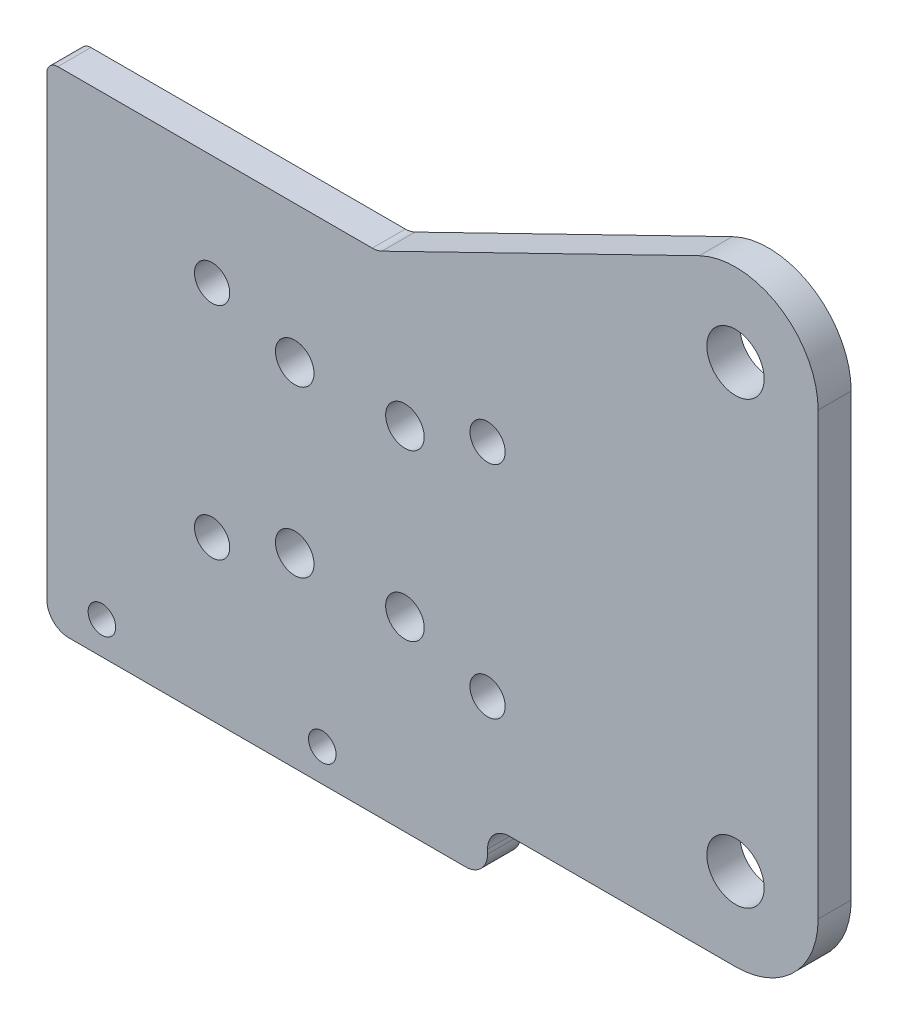
ISO-10303-21;
HEADER;
FILE_DESCRIPTION(('STEP AP214'),'2;1');
FILE_NAME('part.step','',(''),(''),'','','');
FILE_SCHEMA(('AUTOMOTIVE_DESIGN { 1 0 10303 214 1 1 1 1 }'));
ENDSEC;
DATA;
#1=APPLICATION_CONTEXT('core data for automotive mechanical design processes');
#2=APPLICATION_PROTOCOL_DEFINITION('international standard','automotive_design',2000,#1);
#3=PRODUCT_CONTEXT('',#1,'mechanical');
#4=PRODUCT('Part','Part','',(#3));
#5=PRODUCT_RELATED_PRODUCT_CATEGORY('part','',(#4));
#6=PRODUCT_DEFINITION_FORMATION('','',#4);
#7=PRODUCT_DEFINITION_CONTEXT('part definition',#1,'design');
#8=PRODUCT_DEFINITION('design','',#6,#7);
#9=PRODUCT_DEFINITION_SHAPE('','',#8);
#10=(LENGTH_UNIT() NAMED_UNIT(*) SI_UNIT(.MILLI.,.METRE.));
#11=(NAMED_UNIT(*) PLANE_ANGLE_UNIT() SI_UNIT($,.RADIAN.));
#12=(NAMED_UNIT(*) SI_UNIT($,.STERADIAN.) SOLID_ANGLE_UNIT());
#13=UNCERTAINTY_MEASURE_WITH_UNIT(LENGTH_MEASURE(1.E-05),#10,'distance_accuracy_value','');
#14=(GEOMETRIC_REPRESENTATION_CONTEXT(3) GLOBAL_UNCERTAINTY_ASSIGNED_CONTEXT((#13)) GLOBAL_UNIT_ASSIGNED_CONTEXT((#10,
#11,#12)) REPRESENTATION_CONTEXT('',''));
#15=CARTESIAN_POINT('',(0.,0.,0.));
#16=DIRECTION('',(0.,0.,1.));
#17=DIRECTION('',(1.,0.,0.));
#18=AXIS2_PLACEMENT_3D('',#15,#16,#17);
#19=CARTESIAN_POINT('',(27.5,20.,3.));
#20=DIRECTION('',(0.,0.,-1.));
#21=DIRECTION('',(-1.,0.,0.));
#22=AXIS2_PLACEMENT_3D('',#19,#20,#21);
#23=PLANE('',#22);
#24=CARTESIAN_POINT('',(-30.,-28.95,3.));
#25=DIRECTION('',(0.,0.,-1.));
#26=DIRECTION('',(-1.,0.,0.));
#27=AXIS2_PLACEMENT_3D('',#24,#25,#26);
#28=CIRCLE('',#27,1.25);
#29=CARTESIAN_POINT('',(-31.25,-28.95,3.));
#30=VERTEX_POINT('',#29);
#31=EDGE_CURVE('E280',#30,#30,#28,.T.);
#32=ORIENTED_EDGE('',*,*,#31,.T.);
#33=EDGE_LOOP('',(#32));
#34=FACE_BOUND('',#33,.T.);
#35=CARTESIAN_POINT('',(-10.,-28.9500000000002,3.));
#36=DIRECTION('',(0.,0.,-1.));
#37=DIRECTION('',(-1.,0.,0.));
#38=AXIS2_PLACEMENT_3D('',#35,#36,#37);
#39=CIRCLE('',#38,1.25);
#40=CARTESIAN_POINT('',(-11.25,-28.9500000000002,3.));
#41=VERTEX_POINT('',#40);
#42=EDGE_CURVE('E389',#41,#41,#39,.T.);
#43=ORIENTED_EDGE('',*,*,#42,.T.);
#44=EDGE_LOOP('',(#43));
#45=FACE_BOUND('',#44,.T.);
#46=DIRECTION('',(0.,-1.,0.));
#47=VECTOR('',#46,1.);
#48=CARTESIAN_POINT('',(-35.,-27.5,3.));
#49=LINE('',#48,#47);
#50=CARTESIAN_POINT('',(-35.,11.5,3.));
#51=VERTEX_POINT('',#50);
#52=CARTESIAN_POINT('',(-35.,-29.9,3.));
#53=VERTEX_POINT('',#52);
#54=EDGE_CURVE('E168',#51,#53,#49,.T.);
#55=ORIENTED_EDGE('',*,*,#54,.T.);
#56=CARTESIAN_POINT('',(-33.,-29.9,3.));
#57=DIRECTION('',(0.,0.,-1.));
#58=DIRECTION('',(-1.,0.,0.));
#59=AXIS2_PLACEMENT_3D('',#56,#57,#58);
#60=CIRCLE('',#59,2.);
#61=CARTESIAN_POINT('',(-33.,-31.9,3.));
#62=VERTEX_POINT('',#61);
#63=EDGE_CURVE('E251',#53,#62,#60,.F.);
#64=ORIENTED_EDGE('',*,*,#63,.T.);
#65=DIRECTION('',(1.,0.,0.));
#66=VECTOR('',#65,1.);
#67=CARTESIAN_POINT('',(-35.,-31.9,3.));
#68=LINE('',#67,#66);
#69=CARTESIAN_POINT('',(2.99999999999999,-31.9,3.));
#70=VERTEX_POINT('',#69);
#71=EDGE_CURVE('E396',#62,#70,#68,.T.);
#72=ORIENTED_EDGE('',*,*,#71,.T.);
#73=CARTESIAN_POINT('',(2.99999999999999,-29.9,3.));
#74=DIRECTION('',(0.,0.,-1.));
#75=DIRECTION('',(-1.,0.,0.));
#76=AXIS2_PLACEMENT_3D('',#73,#74,#75);
#77=CIRCLE('',#76,2.);
#78=CARTESIAN_POINT('',(4.99999999999999,-29.9,3.));
#79=VERTEX_POINT('',#78);
#80=EDGE_CURVE('E249',#70,#79,#77,.F.);
#81=ORIENTED_EDGE('',*,*,#80,.T.);
#82=DIRECTION('',(0.,1.,0.));
#83=VECTOR('',#82,1.);
#84=CARTESIAN_POINT('',(4.99999999999999,-26.5,3.));
#85=LINE('',#84,#83);
#86=CARTESIAN_POINT('',(4.99999999999999,-29.5,3.));
#87=VERTEX_POINT('',#86);
#88=EDGE_CURVE('E287',#79,#87,#85,.T.);
#89=ORIENTED_EDGE('',*,*,#88,.T.);
#90=CARTESIAN_POINT('',(6.99999999999999,-29.5,3.));
#91=DIRECTION('',(0.,0.,-1.));
#92=DIRECTION('',(-1.,0.,0.));
#93=AXIS2_PLACEMENT_3D('',#90,#91,#92);
#94=CIRCLE('',#93,2.);
#95=CARTESIAN_POINT('',(6.99999999999999,-27.5,3.));
#96=VERTEX_POINT('',#95);
#97=EDGE_CURVE('E11',#87,#96,#94,.T.);
#98=ORIENTED_EDGE('',*,*,#97,.T.);
#99=DIRECTION('',(1.,0.,0.));
#100=VECTOR('',#99,1.);
#101=CARTESIAN_POINT('',(-35.,-27.5,3.));
#102=LINE('',#101,#100);
#103=CARTESIAN_POINT('',(27.4999999999999,-27.5,3.));
#104=VERTEX_POINT('',#103);
#105=EDGE_CURVE('E193',#96,#104,#102,.T.);
#106=ORIENTED_EDGE('',*,*,#105,.T.);
#107=CARTESIAN_POINT('',(27.5,-20.,3.));
#108=DIRECTION('',(0.,0.,1.));
#109=DIRECTION('',(1.,0.,0.));
#110=AXIS2_PLACEMENT_3D('',#107,#108,#109);
#111=CIRCLE('',#110,7.5);
#112=CARTESIAN_POINT('',(35.,-20.,3.));
#113=VERTEX_POINT('',#112);
#114=EDGE_CURVE('E195',#104,#113,#111,.T.);
#115=ORIENTED_EDGE('',*,*,#114,.T.);
#116=DIRECTION('',(0.,1.,0.));
#117=VECTOR('',#116,1.);
#118=CARTESIAN_POINT('',(35.,-20.,3.));
#119=LINE('',#118,#117);
#120=CARTESIAN_POINT('',(35.,19.9999999999999,3.));
#121=VERTEX_POINT('',#120);
#122=EDGE_CURVE('E197',#113,#121,#119,.T.);
#123=ORIENTED_EDGE('',*,*,#122,.T.);
#124=CARTESIAN_POINT('',(27.5,20.,3.));
#125=DIRECTION('',(0.,0.,1.));
#126=DIRECTION('',(-1.,0.,0.));
#127=AXIS2_PLACEMENT_3D('',#124,#125,#126);
#128=CIRCLE('',#127,7.5);
#129=CARTESIAN_POINT('',(24.2134831460674,26.7415730337079,3.));
#130=VERTEX_POINT('',#129);
#131=EDGE_CURVE('E199',#121,#130,#128,.T.);
#132=ORIENTED_EDGE('',*,*,#131,.T.);
#133=DIRECTION('',(0.898876404494382,0.438202247191011,0.));
#134=VECTOR('',#133,1.);
#135=CARTESIAN_POINT('',(-5.00000000000001,12.5,3.));
#136=LINE('',#135,#134);
#137=CARTESIAN_POINT('',(-4.58513396715645,12.7022471910112,3.));
#138=VERTEX_POINT('',#137);
#139=EDGE_CURVE('E172',#138,#130,#136,.T.);
#140=ORIENTED_EDGE('',*,*,#139,.F.);
#141=CARTESIAN_POINT('',(-5.46153846153847,14.5,3.));
#142=DIRECTION('',(0.,0.,-1.));
#143=DIRECTION('',(-1.,0.,0.));
#144=AXIS2_PLACEMENT_3D('',#141,#142,#143);
#145=CIRCLE('',#144,2.);
#146=CARTESIAN_POINT('',(-5.46153846153847,12.5,3.));
#147=VERTEX_POINT('',#146);
#148=EDGE_CURVE('E60',#138,#147,#145,.T.);
#149=ORIENTED_EDGE('',*,*,#148,.T.);
#150=DIRECTION('',(1.,0.,0.));
#151=VECTOR('',#150,1.);
#152=CARTESIAN_POINT('',(-35.,12.5,3.));
#153=LINE('',#152,#151);
#154=CARTESIAN_POINT('',(-34.,12.5,3.));
#155=VERTEX_POINT('',#154);
#156=EDGE_CURVE('E432',#155,#147,#153,.T.);
#157=ORIENTED_EDGE('',*,*,#156,.F.);
#158=CARTESIAN_POINT('',(-34.,11.5,3.));
#159=DIRECTION('',(0.,0.,-1.));
#160=DIRECTION('',(-1.,0.,0.));
#161=AXIS2_PLACEMENT_3D('',#158,#159,#160);
#162=CIRCLE('',#161,1.);
#163=EDGE_CURVE('E219',#155,#51,#162,.F.);
#164=ORIENTED_EDGE('',*,*,#163,.T.);
#165=EDGE_LOOP('',(#55,#64,#72,#81,#89,#98,#106,#115,#123,#132,#140,#149,#157,#164));
#166=FACE_BOUND('',#165,.T.);
#167=CARTESIAN_POINT('',(-2.50000000000001,-15.,3.));
#168=DIRECTION('',(0.,0.,1.));
#169=DIRECTION('',(1.,0.,0.));
#170=AXIS2_PLACEMENT_3D('',#167,#168,#169);
#171=CIRCLE('',#170,1.75);
#172=CARTESIAN_POINT('',(-0.750000000000011,-15.,3.));
#173=VERTEX_POINT('',#172);
#174=EDGE_CURVE('E398',#173,#173,#171,.T.);
#175=ORIENTED_EDGE('',*,*,#174,.F.);
#176=EDGE_LOOP('',(#175));
#177=FACE_BOUND('',#176,.T.);
#178=CARTESIAN_POINT('',(-12.5,-15.,3.));
#179=DIRECTION('',(0.,0.,1.));
#180=DIRECTION('',(1.,0.,0.));
#181=AXIS2_PLACEMENT_3D('',#178,#179,#180);
#182=CIRCLE('',#181,1.75);
#183=CARTESIAN_POINT('',(-10.75,-15.,3.));
#184=VERTEX_POINT('',#183);
#185=EDGE_CURVE('E404',#184,#184,#182,.T.);
#186=ORIENTED_EDGE('',*,*,#185,.F.);
#187=EDGE_LOOP('',(#186));
#188=FACE_BOUND('',#187,.T.);
#189=CARTESIAN_POINT('',(-12.5,0.,3.));
#190=DIRECTION('',(0.,0.,1.));
#191=DIRECTION('',(1.,0.,0.));
#192=AXIS2_PLACEMENT_3D('',#189,#190,#191);
#193=CIRCLE('',#192,1.75);
#194=CARTESIAN_POINT('',(-10.75,0.,3.));
#195=VERTEX_POINT('',#194);
#196=EDGE_CURVE('E401',#195,#195,#193,.T.);
#197=ORIENTED_EDGE('',*,*,#196,.F.);
#198=EDGE_LOOP('',(#197));
#199=FACE_BOUND('',#198,.T.);
#200=CARTESIAN_POINT('',(-2.50000000000001,0.,3.));
#201=DIRECTION('',(0.,0.,1.));
#202=DIRECTION('',(1.,0.,0.));
#203=AXIS2_PLACEMENT_3D('',#200,#201,#202);
#204=CIRCLE('',#203,1.75);
#205=CARTESIAN_POINT('',(-0.750000000000011,0.,3.));
#206=VERTEX_POINT('',#205);
#207=EDGE_CURVE('E229',#206,#206,#204,.T.);
#208=ORIENTED_EDGE('',*,*,#207,.F.);
#209=EDGE_LOOP('',(#208));
#210=FACE_BOUND('',#209,.T.);
#211=CARTESIAN_POINT('',(-20.,-17.5,3.));
#212=DIRECTION('',(0.,0.,1.));
#213=DIRECTION('',(-1.,0.,0.));
#214=AXIS2_PLACEMENT_3D('',#211,#212,#213);
#215=CIRCLE('',#214,1.6);
#216=CARTESIAN_POINT('',(-21.6,-17.5,3.));
#217=VERTEX_POINT('',#216);
#218=EDGE_CURVE('E238',#217,#217,#215,.T.);
#219=ORIENTED_EDGE('',*,*,#218,.F.);
#220=EDGE_LOOP('',(#219));
#221=FACE_BOUND('',#220,.T.);
#222=CARTESIAN_POINT('',(4.99999999999999,-17.5,3.));
#223=DIRECTION('',(0.,0.,1.));
#224=DIRECTION('',(1.,0.,0.));
#225=AXIS2_PLACEMENT_3D('',#222,#223,#224);
#226=CIRCLE('',#225,1.6);
#227=CARTESIAN_POINT('',(6.59999999999999,-17.5,3.));
#228=VERTEX_POINT('',#227);
#229=EDGE_CURVE('E421',#228,#228,#226,.T.);
#230=ORIENTED_EDGE('',*,*,#229,.F.);
#231=EDGE_LOOP('',(#230));
#232=FACE_BOUND('',#231,.T.);
#233=CARTESIAN_POINT('',(4.99999999999999,2.49999999999999,3.));
#234=DIRECTION('',(0.,0.,1.));
#235=DIRECTION('',(-1.,0.,0.));
#236=AXIS2_PLACEMENT_3D('',#233,#234,#235);
#237=CIRCLE('',#236,1.6);
#238=CARTESIAN_POINT('',(3.39999999999999,2.49999999999999,3.));
#239=VERTEX_POINT('',#238);
#240=EDGE_CURVE('E415',#239,#239,#237,.T.);
#241=ORIENTED_EDGE('',*,*,#240,.F.);
#242=EDGE_LOOP('',(#241));
#243=FACE_BOUND('',#242,.T.);
#244=CARTESIAN_POINT('',(-20.,2.49999999999999,3.));
#245=DIRECTION('',(0.,0.,1.));
#246=DIRECTION('',(1.,0.,0.));
#247=AXIS2_PLACEMENT_3D('',#244,#245,#246);
#248=CIRCLE('',#247,1.6);
#249=CARTESIAN_POINT('',(-18.4,2.49999999999999,3.));
#250=VERTEX_POINT('',#249);
#251=EDGE_CURVE('E414',#250,#250,#248,.T.);
#252=ORIENTED_EDGE('',*,*,#251,.F.);
#253=EDGE_LOOP('',(#252));
#254=FACE_BOUND('',#253,.T.);
#255=CARTESIAN_POINT('',(27.5,20.,3.));
#256=DIRECTION('',(0.,0.,1.));
#257=DIRECTION('',(1.,0.,0.));
#258=AXIS2_PLACEMENT_3D('',#255,#256,#257);
#259=CIRCLE('',#258,2.6);
#260=CARTESIAN_POINT('',(30.1,20.,3.));
#261=VERTEX_POINT('',#260);
#262=EDGE_CURVE('E185',#261,#261,#259,.T.);
#263=ORIENTED_EDGE('',*,*,#262,.F.);
#264=EDGE_LOOP('',(#263));
#265=FACE_BOUND('',#264,.T.);
#266=CARTESIAN_POINT('',(27.5,-20.,3.));
#267=DIRECTION('',(0.,0.,1.));
#268=DIRECTION('',(-1.,0.,0.));
#269=AXIS2_PLACEMENT_3D('',#266,#267,#268);
#270=CIRCLE('',#269,2.6);
#271=CARTESIAN_POINT('',(24.9,-20.,3.));
#272=VERTEX_POINT('',#271);
#273=EDGE_CURVE('E177',#272,#272,#270,.T.);
#274=ORIENTED_EDGE('',*,*,#273,.F.);
#275=EDGE_LOOP('',(#274));
#276=FACE_BOUND('',#275,.T.);
#277=ADVANCED_FACE('F45',(#34,#45,#166,#177,#188,#199,#210,#221,#232,#243,#254,#265,#276),#23,.F.);
#278=CARTESIAN_POINT('',(27.5,20.,0.));
#279=DIRECTION('',(0.,0.,-1.));
#280=DIRECTION('',(-1.,0.,0.));
#281=AXIS2_PLACEMENT_3D('',#278,#279,#280);
#282=PLANE('',#281);
#283=CARTESIAN_POINT('',(-30.,-28.95,0.));
#284=DIRECTION('',(0.,0.,-1.));
#285=DIRECTION('',(-1.,0.,0.));
#286=AXIS2_PLACEMENT_3D('',#283,#284,#285);
#287=CIRCLE('',#286,1.25);
#288=CARTESIAN_POINT('',(-31.25,-28.95,0.));
#289=VERTEX_POINT('',#288);
#290=EDGE_CURVE('E387',#289,#289,#287,.T.);
#291=ORIENTED_EDGE('',*,*,#290,.F.);
#292=EDGE_LOOP('',(#291));
#293=FACE_BOUND('',#292,.T.);
#294=CARTESIAN_POINT('',(-10.,-28.9500000000002,0.));
#295=DIRECTION('',(0.,0.,-1.));
#296=DIRECTION('',(-1.,0.,0.));
#297=AXIS2_PLACEMENT_3D('',#294,#295,#296);
#298=CIRCLE('',#297,1.25);
#299=CARTESIAN_POINT('',(-11.25,-28.9500000000002,0.));
#300=VERTEX_POINT('',#299);
#301=EDGE_CURVE('E650',#300,#300,#298,.T.);
#302=ORIENTED_EDGE('',*,*,#301,.F.);
#303=EDGE_LOOP('',(#302));
#304=FACE_BOUND('',#303,.T.);
#305=DIRECTION('',(-1.,0.,0.));
#306=VECTOR('',#305,1.);
#307=CARTESIAN_POINT('',(-35.,-31.9,0.));
#308=LINE('',#307,#306);
#309=CARTESIAN_POINT('',(2.99999999999999,-31.9,0.));
#310=VERTEX_POINT('',#309);
#311=CARTESIAN_POINT('',(-33.,-31.9,0.));
#312=VERTEX_POINT('',#311);
#313=EDGE_CURVE('E279',#310,#312,#308,.T.);
#314=ORIENTED_EDGE('',*,*,#313,.T.);
#315=CARTESIAN_POINT('',(-33.,-29.9,0.));
#316=DIRECTION('',(0.,0.,-1.));
#317=DIRECTION('',(-1.,0.,0.));
#318=AXIS2_PLACEMENT_3D('',#315,#316,#317);
#319=CIRCLE('',#318,2.);
#320=CARTESIAN_POINT('',(-35.,-29.9,0.));
#321=VERTEX_POINT('',#320);
#322=EDGE_CURVE('E245',#312,#321,#319,.T.);
#323=ORIENTED_EDGE('',*,*,#322,.T.);
#324=DIRECTION('',(0.,-1.,0.));
#325=VECTOR('',#324,1.);
#326=CARTESIAN_POINT('',(-35.,-27.5,0.));
#327=LINE('',#326,#325);
#328=CARTESIAN_POINT('',(-35.,11.5,0.));
#329=VERTEX_POINT('',#328);
#330=EDGE_CURVE('E188',#329,#321,#327,.T.);
#331=ORIENTED_EDGE('',*,*,#330,.F.);
#332=CARTESIAN_POINT('',(-34.,11.5,0.));
#333=DIRECTION('',(0.,0.,-1.));
#334=DIRECTION('',(-1.,0.,0.));
#335=AXIS2_PLACEMENT_3D('',#332,#333,#334);
#336=CIRCLE('',#335,1.);
#337=CARTESIAN_POINT('',(-34.,12.5,0.));
#338=VERTEX_POINT('',#337);
#339=EDGE_CURVE('E215',#329,#338,#336,.T.);
#340=ORIENTED_EDGE('',*,*,#339,.T.);
#341=DIRECTION('',(1.,0.,0.));
#342=VECTOR('',#341,1.);
#343=CARTESIAN_POINT('',(-35.,12.5,0.));
#344=LINE('',#343,#342);
#345=CARTESIAN_POINT('',(-5.46153846153847,12.5,0.));
#346=VERTEX_POINT('',#345);
#347=EDGE_CURVE('E159',#338,#346,#344,.T.);
#348=ORIENTED_EDGE('',*,*,#347,.T.);
#349=CARTESIAN_POINT('',(-5.46153846153847,14.5,0.));
#350=DIRECTION('',(0.,0.,-1.));
#351=DIRECTION('',(-1.,0.,0.));
#352=AXIS2_PLACEMENT_3D('',#349,#350,#351);
#353=CIRCLE('',#352,2.);
#354=CARTESIAN_POINT('',(-4.58513396715645,12.7022471910112,0.));
#355=VERTEX_POINT('',#354);
#356=EDGE_CURVE('E155',#346,#355,#353,.F.);
#357=ORIENTED_EDGE('',*,*,#356,.T.);
#358=DIRECTION('',(0.898876404494382,0.438202247191011,0.));
#359=VECTOR('',#358,1.);
#360=CARTESIAN_POINT('',(-5.00000000000001,12.5,0.));
#361=LINE('',#360,#359);
#362=CARTESIAN_POINT('',(24.2134831460674,26.7415730337079,0.));
#363=VERTEX_POINT('',#362);
#364=EDGE_CURVE('E146',#355,#363,#361,.T.);
#365=ORIENTED_EDGE('',*,*,#364,.T.);
#366=CARTESIAN_POINT('',(27.5,20.,0.));
#367=DIRECTION('',(0.,0.,1.));
#368=DIRECTION('',(-1.,0.,0.));
#369=AXIS2_PLACEMENT_3D('',#366,#367,#368);
#370=CIRCLE('',#369,7.5);
#371=CARTESIAN_POINT('',(35.,19.9999999999999,0.));
#372=VERTEX_POINT('',#371);
#373=EDGE_CURVE('E152',#372,#363,#370,.T.);
#374=ORIENTED_EDGE('',*,*,#373,.F.);
#375=DIRECTION('',(0.,1.,0.));
#376=VECTOR('',#375,1.);
#377=CARTESIAN_POINT('',(35.,-20.,0.));
#378=LINE('',#377,#376);
#379=CARTESIAN_POINT('',(35.,-20.,0.));
#380=VERTEX_POINT('',#379);
#381=EDGE_CURVE('E169',#380,#372,#378,.T.);
#382=ORIENTED_EDGE('',*,*,#381,.F.);
#383=CARTESIAN_POINT('',(27.5,-20.,0.));
#384=DIRECTION('',(0.,0.,1.));
#385=DIRECTION('',(1.,0.,0.));
#386=AXIS2_PLACEMENT_3D('',#383,#384,#385);
#387=CIRCLE('',#386,7.5);
#388=CARTESIAN_POINT('',(27.4999999999999,-27.5,0.));
#389=VERTEX_POINT('',#388);
#390=EDGE_CURVE('E205',#389,#380,#387,.T.);
#391=ORIENTED_EDGE('',*,*,#390,.F.);
#392=DIRECTION('',(1.,0.,0.));
#393=VECTOR('',#392,1.);
#394=CARTESIAN_POINT('',(-35.,-27.5,0.));
#395=LINE('',#394,#393);
#396=CARTESIAN_POINT('',(6.99999999999999,-27.5,0.));
#397=VERTEX_POINT('',#396);
#398=EDGE_CURVE('E203',#397,#389,#395,.T.);
#399=ORIENTED_EDGE('',*,*,#398,.F.);
#400=CARTESIAN_POINT('',(6.99999999999999,-29.5,0.));
#401=DIRECTION('',(0.,0.,-1.));
#402=DIRECTION('',(-1.,0.,0.));
#403=AXIS2_PLACEMENT_3D('',#400,#401,#402);
#404=CIRCLE('',#403,2.);
#405=CARTESIAN_POINT('',(4.99999999999999,-29.5,0.));
#406=VERTEX_POINT('',#405);
#407=EDGE_CURVE('E53',#397,#406,#404,.F.);
#408=ORIENTED_EDGE('',*,*,#407,.T.);
#409=DIRECTION('',(0.,-1.,0.));
#410=VECTOR('',#409,1.);
#411=CARTESIAN_POINT('',(4.99999999999999,-26.5,0.));
#412=LINE('',#411,#410);
#413=CARTESIAN_POINT('',(4.99999999999999,-29.9,0.));
#414=VERTEX_POINT('',#413);
#415=EDGE_CURVE('E269',#406,#414,#412,.T.);
#416=ORIENTED_EDGE('',*,*,#415,.T.);
#417=CARTESIAN_POINT('',(2.99999999999999,-29.9,0.));
#418=DIRECTION('',(0.,0.,-1.));
#419=DIRECTION('',(-1.,0.,0.));
#420=AXIS2_PLACEMENT_3D('',#417,#418,#419);
#421=CIRCLE('',#420,2.);
#422=EDGE_CURVE('E243',#414,#310,#421,.T.);
#423=ORIENTED_EDGE('',*,*,#422,.T.);
#424=EDGE_LOOP('',(#314,#323,#331,#340,#348,#357,#365,#374,#382,#391,#399,#408,#416,#423));
#425=FACE_BOUND('',#424,.T.);
#426=CARTESIAN_POINT('',(-2.50000000000001,-15.,0.));
#427=DIRECTION('',(0.,0.,-1.));
#428=DIRECTION('',(-1.,0.,0.));
#429=AXIS2_PLACEMENT_3D('',#426,#427,#428);
#430=CIRCLE('',#429,1.75);
#431=CARTESIAN_POINT('',(-4.25000000000001,-15.,0.));
#432=VERTEX_POINT('',#431);
#433=EDGE_CURVE('E235',#432,#432,#430,.T.);
#434=ORIENTED_EDGE('',*,*,#433,.F.);
#435=EDGE_LOOP('',(#434));
#436=FACE_BOUND('',#435,.T.);
#437=CARTESIAN_POINT('',(-12.5,-15.,0.));
#438=DIRECTION('',(0.,0.,-1.));
#439=DIRECTION('',(-1.,0.,0.));
#440=AXIS2_PLACEMENT_3D('',#437,#438,#439);
#441=CIRCLE('',#440,1.75);
#442=CARTESIAN_POINT('',(-14.25,-15.,0.));
#443=VERTEX_POINT('',#442);
#444=EDGE_CURVE('E232',#443,#443,#441,.T.);
#445=ORIENTED_EDGE('',*,*,#444,.F.);
#446=EDGE_LOOP('',(#445));
#447=FACE_BOUND('',#446,.T.);
#448=CARTESIAN_POINT('',(-12.5,0.,0.));
#449=DIRECTION('',(0.,0.,-1.));
#450=DIRECTION('',(-1.,0.,0.));
#451=AXIS2_PLACEMENT_3D('',#448,#449,#450);
#452=CIRCLE('',#451,1.75);
#453=CARTESIAN_POINT('',(-14.25,0.,0.));
#454=VERTEX_POINT('',#453);
#455=EDGE_CURVE('E228',#454,#454,#452,.T.);
#456=ORIENTED_EDGE('',*,*,#455,.F.);
#457=EDGE_LOOP('',(#456));
#458=FACE_BOUND('',#457,.T.);
#459=CARTESIAN_POINT('',(-2.50000000000001,0.,0.));
#460=DIRECTION('',(0.,0.,-1.));
#461=DIRECTION('',(-1.,0.,0.));
#462=AXIS2_PLACEMENT_3D('',#459,#460,#461);
#463=CIRCLE('',#462,1.75);
#464=CARTESIAN_POINT('',(-4.25000000000001,0.,0.));
#465=VERTEX_POINT('',#464);
#466=EDGE_CURVE('E225',#465,#465,#463,.T.);
#467=ORIENTED_EDGE('',*,*,#466,.F.);
#468=EDGE_LOOP('',(#467));
#469=FACE_BOUND('',#468,.T.);
#470=CARTESIAN_POINT('',(-20.,-17.5,0.));
#471=DIRECTION('',(0.,0.,1.));
#472=DIRECTION('',(-1.,0.,0.));
#473=AXIS2_PLACEMENT_3D('',#470,#471,#472);
#474=CIRCLE('',#473,1.6);
#475=CARTESIAN_POINT('',(-21.6,-17.5,0.));
#476=VERTEX_POINT('',#475);
#477=EDGE_CURVE('E424',#476,#476,#474,.T.);
#478=ORIENTED_EDGE('',*,*,#477,.T.);
#479=EDGE_LOOP('',(#478));
#480=FACE_BOUND('',#479,.T.);
#481=CARTESIAN_POINT('',(4.99999999999999,-17.5,0.));
#482=DIRECTION('',(0.,0.,1.));
#483=DIRECTION('',(1.,0.,0.));
#484=AXIS2_PLACEMENT_3D('',#481,#482,#483);
#485=CIRCLE('',#484,1.6);
#486=CARTESIAN_POINT('',(6.59999999999999,-17.5,0.));
#487=VERTEX_POINT('',#486);
#488=EDGE_CURVE('E418',#487,#487,#485,.T.);
#489=ORIENTED_EDGE('',*,*,#488,.T.);
#490=EDGE_LOOP('',(#489));
#491=FACE_BOUND('',#490,.T.);
#492=CARTESIAN_POINT('',(4.99999999999999,2.49999999999999,0.));
#493=DIRECTION('',(0.,0.,1.));
#494=DIRECTION('',(-1.,0.,0.));
#495=AXIS2_PLACEMENT_3D('',#492,#493,#494);
#496=CIRCLE('',#495,1.6);
#497=CARTESIAN_POINT('',(3.39999999999999,2.49999999999999,0.));
#498=VERTEX_POINT('',#497);
#499=EDGE_CURVE('E411',#498,#498,#496,.T.);
#500=ORIENTED_EDGE('',*,*,#499,.T.);
#501=EDGE_LOOP('',(#500));
#502=FACE_BOUND('',#501,.T.);
#503=CARTESIAN_POINT('',(-20.,2.49999999999999,0.));
#504=DIRECTION('',(0.,0.,1.));
#505=DIRECTION('',(1.,0.,0.));
#506=AXIS2_PLACEMENT_3D('',#503,#504,#505);
#507=CIRCLE('',#506,1.6);
#508=CARTESIAN_POINT('',(-18.4,2.49999999999999,0.));
#509=VERTEX_POINT('',#508);
#510=EDGE_CURVE('E429',#509,#509,#507,.T.);
#511=ORIENTED_EDGE('',*,*,#510,.T.);
#512=EDGE_LOOP('',(#511));
#513=FACE_BOUND('',#512,.T.);
#514=CARTESIAN_POINT('',(27.5,20.,0.));
#515=DIRECTION('',(0.,0.,1.));
#516=DIRECTION('',(1.,0.,0.));
#517=AXIS2_PLACEMENT_3D('',#514,#515,#516);
#518=CIRCLE('',#517,2.6);
#519=CARTESIAN_POINT('',(30.1,20.,0.));
#520=VERTEX_POINT('',#519);
#521=EDGE_CURVE('E183',#520,#520,#518,.T.);
#522=ORIENTED_EDGE('',*,*,#521,.T.);
#523=EDGE_LOOP('',(#522));
#524=FACE_BOUND('',#523,.T.);
#525=CARTESIAN_POINT('',(27.5,-20.,0.));
#526=DIRECTION('',(0.,0.,1.));
#527=DIRECTION('',(-1.,0.,0.));
#528=AXIS2_PLACEMENT_3D('',#525,#526,#527);
#529=CIRCLE('',#528,2.6);
#530=CARTESIAN_POINT('',(24.9,-20.,0.));
#531=VERTEX_POINT('',#530);
#532=EDGE_CURVE('E174',#531,#531,#529,.T.);
#533=ORIENTED_EDGE('',*,*,#532,.T.);
#534=EDGE_LOOP('',(#533));
#535=FACE_BOUND('',#534,.T.);
#536=ADVANCED_FACE('F149',(#293,#304,#425,#436,#447,#458,#469,#480,#491,#502,#513,#524,#535),
#282,.T.);
#537=CARTESIAN_POINT('',(-35.,-27.5,3.));
#538=DIRECTION('',(1.,0.,0.));
#539=DIRECTION('',(0.,0.,-1.));
#540=AXIS2_PLACEMENT_3D('',#537,#538,#539);
#541=PLANE('',#540);
#542=ORIENTED_EDGE('',*,*,#330,.T.);
#543=DIRECTION('',(0.,0.,-1.));
#544=VECTOR('',#543,1.);
#545=CARTESIAN_POINT('',(-35.,-29.9,3.));
#546=LINE('',#545,#544);
#547=EDGE_CURVE('E247',#321,#53,#546,.F.);
#548=ORIENTED_EDGE('',*,*,#547,.T.);
#549=ORIENTED_EDGE('',*,*,#54,.F.);
#550=DIRECTION('',(0.,0.,1.));
#551=VECTOR('',#550,1.);
#552=CARTESIAN_POINT('',(-35.,11.5,3.));
#553=LINE('',#552,#551);
#554=EDGE_CURVE('E217',#51,#329,#553,.F.);
#555=ORIENTED_EDGE('',*,*,#554,.T.);
#556=EDGE_LOOP('',(#542,#548,#549,#555));
#557=FACE_BOUND('',#556,.T.);
#558=ADVANCED_FACE('F314',(#557),#541,.F.);
#559=CARTESIAN_POINT('',(-35.,-27.5,3.));
#560=DIRECTION('',(0.,1.,0.));
#561=DIRECTION('',(0.,0.,1.));
#562=AXIS2_PLACEMENT_3D('',#559,#560,#561);
#563=PLANE('',#562);
#564=ORIENTED_EDGE('',*,*,#105,.F.);
#565=DIRECTION('',(0.,0.,-1.));
#566=VECTOR('',#565,1.);
#567=CARTESIAN_POINT('',(6.99999999999999,-27.5,3.));
#568=LINE('',#567,#566);
#569=EDGE_CURVE('E257',#96,#397,#568,.T.);
#570=ORIENTED_EDGE('',*,*,#569,.T.);
#571=ORIENTED_EDGE('',*,*,#398,.T.);
#572=DIRECTION('',(0.,0.,-1.));
#573=VECTOR('',#572,1.);
#574=CARTESIAN_POINT('',(27.4999999999999,-27.5,3.));
#575=LINE('',#574,#573);
#576=EDGE_CURVE('E212',#104,#389,#575,.T.);
#577=ORIENTED_EDGE('',*,*,#576,.F.);
#578=EDGE_LOOP('',(#564,#570,#571,#577));
#579=FACE_BOUND('',#578,.T.);
#580=ADVANCED_FACE('F289',(#579),#563,.F.);
#581=CARTESIAN_POINT('',(27.5,-20.,3.));
#582=DIRECTION('',(0.,0.,-1.));
#583=DIRECTION('',(-1.,0.,0.));
#584=AXIS2_PLACEMENT_3D('',#581,#582,#583);
#585=CYLINDRICAL_SURFACE('',#584,7.5);
#586=ORIENTED_EDGE('',*,*,#390,.T.);
#587=DIRECTION('',(0.,0.,-1.));
#588=VECTOR('',#587,1.);
#589=CARTESIAN_POINT('',(35.,-20.,3.));
#590=LINE('',#589,#588);
#591=EDGE_CURVE('E209',#113,#380,#590,.T.);
#592=ORIENTED_EDGE('',*,*,#591,.F.);
#593=ORIENTED_EDGE('',*,*,#114,.F.);
#594=ORIENTED_EDGE('',*,*,#576,.T.);
#595=EDGE_LOOP('',(#586,#592,#593,#594));
#596=FACE_BOUND('',#595,.T.);
#597=ADVANCED_FACE('F293',(#596),#585,.T.);
#598=CARTESIAN_POINT('',(35.,-20.,3.));
#599=DIRECTION('',(-1.,0.,0.));
#600=DIRECTION('',(0.,0.,1.));
#601=AXIS2_PLACEMENT_3D('',#598,#599,#600);
#602=PLANE('',#601);
#603=ORIENTED_EDGE('',*,*,#381,.T.);
#604=DIRECTION('',(0.,0.,-1.));
#605=VECTOR('',#604,1.);
#606=CARTESIAN_POINT('',(35.,19.9999999999999,3.));
#607=LINE('',#606,#605);
#608=EDGE_CURVE('E167',#121,#372,#607,.T.);
#609=ORIENTED_EDGE('',*,*,#608,.F.);
#610=ORIENTED_EDGE('',*,*,#122,.F.);
#611=ORIENTED_EDGE('',*,*,#591,.T.);
#612=EDGE_LOOP('',(#603,#609,#610,#611));
#613=FACE_BOUND('',#612,.T.);
#614=ADVANCED_FACE('F296',(#613),#602,.F.);
#615=CARTESIAN_POINT('',(27.5,20.,3.));
#616=DIRECTION('',(0.,0.,-1.));
#617=DIRECTION('',(-1.,0.,0.));
#618=AXIS2_PLACEMENT_3D('',#615,#616,#617);
#619=CYLINDRICAL_SURFACE('',#618,7.5);
#620=ORIENTED_EDGE('',*,*,#373,.T.);
#621=DIRECTION('',(0.,0.,1.));
#622=VECTOR('',#621,1.);
#623=CARTESIAN_POINT('',(24.2134831460674,26.7415730337079,0.));
#624=LINE('',#623,#622);
#625=EDGE_CURVE('E158',#363,#130,#624,.T.);
#626=ORIENTED_EDGE('',*,*,#625,.T.);
#627=ORIENTED_EDGE('',*,*,#131,.F.);
#628=ORIENTED_EDGE('',*,*,#608,.T.);
#629=EDGE_LOOP('',(#620,#626,#627,#628));
#630=FACE_BOUND('',#629,.T.);
#631=ADVANCED_FACE('F164',(#630),#619,.T.);
#632=CARTESIAN_POINT('',(27.5,20.,3.));
#633=DIRECTION('',(0.,0.,-1.));
#634=DIRECTION('',(-1.,0.,0.));
#635=AXIS2_PLACEMENT_3D('',#632,#633,#634);
#636=CYLINDRICAL_SURFACE('',#635,2.6);
#637=ORIENTED_EDGE('',*,*,#262,.T.);
#638=EDGE_LOOP('',(#637));
#639=FACE_BOUND('',#638,.T.);
#640=ORIENTED_EDGE('',*,*,#521,.F.);
#641=EDGE_LOOP('',(#640));
#642=FACE_BOUND('',#641,.T.);
#643=ADVANCED_FACE('F304',(#639,#642),#636,.F.);
#644=CARTESIAN_POINT('',(27.5,-20.,3.));
#645=DIRECTION('',(0.,0.,-1.));
#646=DIRECTION('',(-1.,0.,0.));
#647=AXIS2_PLACEMENT_3D('',#644,#645,#646);
#648=CYLINDRICAL_SURFACE('',#647,2.6);
#649=ORIENTED_EDGE('',*,*,#273,.T.);
#650=EDGE_LOOP('',(#649));
#651=FACE_BOUND('',#650,.T.);
#652=ORIENTED_EDGE('',*,*,#532,.F.);
#653=EDGE_LOOP('',(#652));
#654=FACE_BOUND('',#653,.T.);
#655=ADVANCED_FACE('F321',(#651,#654),#648,.F.);
#656=CARTESIAN_POINT('',(-5.00000000000001,12.5,0.));
#657=DIRECTION('',(0.438202247191011,-0.898876404494382,0.));
#658=DIRECTION('',(0.898876404494382,0.438202247191011,0.));
#659=AXIS2_PLACEMENT_3D('',#656,#657,#658);
#660=PLANE('',#659);
#661=ORIENTED_EDGE('',*,*,#364,.F.);
#662=DIRECTION('',(0.,0.,1.));
#663=VECTOR('',#662,1.);
#664=CARTESIAN_POINT('',(-4.58513396715645,12.7022471910112,3.));
#665=LINE('',#664,#663);
#666=EDGE_CURVE('E253',#355,#138,#665,.T.);
#667=ORIENTED_EDGE('',*,*,#666,.T.);
#668=ORIENTED_EDGE('',*,*,#139,.T.);
#669=ORIENTED_EDGE('',*,*,#625,.F.);
#670=EDGE_LOOP('',(#661,#667,#668,#669));
#671=FACE_BOUND('',#670,.T.);
#672=ADVANCED_FACE('F171',(#671),#660,.F.);
#673=CARTESIAN_POINT('',(-35.,12.5,0.));
#674=DIRECTION('',(0.,-1.,0.));
#675=DIRECTION('',(0.,0.,-1.));
#676=AXIS2_PLACEMENT_3D('',#673,#674,#675);
#677=PLANE('',#676);
#678=ORIENTED_EDGE('',*,*,#156,.T.);
#679=DIRECTION('',(0.,0.,1.));
#680=VECTOR('',#679,1.);
#681=CARTESIAN_POINT('',(-5.46153846153847,12.5,0.));
#682=LINE('',#681,#680);
#683=EDGE_CURVE('E255',#147,#346,#682,.F.);
#684=ORIENTED_EDGE('',*,*,#683,.T.);
#685=ORIENTED_EDGE('',*,*,#347,.F.);
#686=DIRECTION('',(0.,0.,1.));
#687=VECTOR('',#686,1.);
#688=CARTESIAN_POINT('',(-34.,12.5,0.));
#689=LINE('',#688,#687);
#690=EDGE_CURVE('E221',#338,#155,#689,.T.);
#691=ORIENTED_EDGE('',*,*,#690,.T.);
#692=EDGE_LOOP('',(#678,#684,#685,#691));
#693=FACE_BOUND('',#692,.T.);
#694=ADVANCED_FACE('F326',(#693),#677,.F.);
#695=CARTESIAN_POINT('',(-20.,2.49999999999999,0.));
#696=DIRECTION('',(0.,0.,1.));
#697=DIRECTION('',(1.,0.,0.));
#698=AXIS2_PLACEMENT_3D('',#695,#696,#697);
#699=CYLINDRICAL_SURFACE('',#698,1.6);
#700=ORIENTED_EDGE('',*,*,#510,.F.);
#701=EDGE_LOOP('',(#700));
#702=FACE_BOUND('',#701,.T.);
#703=ORIENTED_EDGE('',*,*,#251,.T.);
#704=EDGE_LOOP('',(#703));
#705=FACE_BOUND('',#704,.T.);
#706=ADVANCED_FACE('F329',(#702,#705),#699,.F.);
#707=CARTESIAN_POINT('',(4.99999999999999,2.49999999999999,0.));
#708=DIRECTION('',(0.,0.,1.));
#709=DIRECTION('',(1.,0.,0.));
#710=AXIS2_PLACEMENT_3D('',#707,#708,#709);
#711=CYLINDRICAL_SURFACE('',#710,1.6);
#712=ORIENTED_EDGE('',*,*,#499,.F.);
#713=EDGE_LOOP('',(#712));
#714=FACE_BOUND('',#713,.T.);
#715=ORIENTED_EDGE('',*,*,#240,.T.);
#716=EDGE_LOOP('',(#715));
#717=FACE_BOUND('',#716,.T.);
#718=ADVANCED_FACE('F335',(#714,#717),#711,.F.);
#719=CARTESIAN_POINT('',(4.99999999999999,-17.5,0.));
#720=DIRECTION('',(0.,0.,1.));
#721=DIRECTION('',(1.,0.,0.));
#722=AXIS2_PLACEMENT_3D('',#719,#720,#721);
#723=CYLINDRICAL_SURFACE('',#722,1.6);
#724=ORIENTED_EDGE('',*,*,#488,.F.);
#725=EDGE_LOOP('',(#724));
#726=FACE_BOUND('',#725,.T.);
#727=ORIENTED_EDGE('',*,*,#229,.T.);
#728=EDGE_LOOP('',(#727));
#729=FACE_BOUND('',#728,.T.);
#730=ADVANCED_FACE('F341',(#726,#729),#723,.F.);
#731=CARTESIAN_POINT('',(-20.,-17.5,0.));
#732=DIRECTION('',(0.,0.,1.));
#733=DIRECTION('',(1.,0.,0.));
#734=AXIS2_PLACEMENT_3D('',#731,#732,#733);
#735=CYLINDRICAL_SURFACE('',#734,1.6);
#736=ORIENTED_EDGE('',*,*,#477,.F.);
#737=EDGE_LOOP('',(#736));
#738=FACE_BOUND('',#737,.T.);
#739=ORIENTED_EDGE('',*,*,#218,.T.);
#740=EDGE_LOOP('',(#739));
#741=FACE_BOUND('',#740,.T.);
#742=ADVANCED_FACE('F337',(#738,#741),#735,.F.);
#743=CARTESIAN_POINT('',(-34.,11.5,0.));
#744=DIRECTION('',(0.,0.,1.));
#745=DIRECTION('',(1.,0.,0.));
#746=AXIS2_PLACEMENT_3D('',#743,#744,#745);
#747=CYLINDRICAL_SURFACE('',#746,1.);
#748=ORIENTED_EDGE('',*,*,#339,.F.);
#749=ORIENTED_EDGE('',*,*,#554,.F.);
#750=ORIENTED_EDGE('',*,*,#163,.F.);
#751=ORIENTED_EDGE('',*,*,#690,.F.);
#752=EDGE_LOOP('',(#748,#749,#750,#751));
#753=FACE_BOUND('',#752,.T.);
#754=ADVANCED_FACE('F340',(#753),#747,.T.);
#755=CARTESIAN_POINT('',(-2.50000000000001,0.,-7.));
#756=DIRECTION('',(0.,0.,1.));
#757=DIRECTION('',(1.,0.,0.));
#758=AXIS2_PLACEMENT_3D('',#755,#756,#757);
#759=CYLINDRICAL_SURFACE('',#758,1.75);
#760=ORIENTED_EDGE('',*,*,#466,.T.);
#761=EDGE_LOOP('',(#760));
#762=FACE_BOUND('',#761,.T.);
#763=ORIENTED_EDGE('',*,*,#207,.T.);
#764=EDGE_LOOP('',(#763));
#765=FACE_BOUND('',#764,.T.);
#766=ADVANCED_FACE('F349',(#762,#765),#759,.F.);
#767=CARTESIAN_POINT('',(-12.5,0.,-7.));
#768=DIRECTION('',(0.,0.,1.));
#769=DIRECTION('',(1.,0.,0.));
#770=AXIS2_PLACEMENT_3D('',#767,#768,#769);
#771=CYLINDRICAL_SURFACE('',#770,1.75);
#772=ORIENTED_EDGE('',*,*,#455,.T.);
#773=EDGE_LOOP('',(#772));
#774=FACE_BOUND('',#773,.T.);
#775=ORIENTED_EDGE('',*,*,#196,.T.);
#776=EDGE_LOOP('',(#775));
#777=FACE_BOUND('',#776,.T.);
#778=ADVANCED_FACE('F352',(#774,#777),#771,.F.);
#779=CARTESIAN_POINT('',(-12.5,-15.,-7.));
#780=DIRECTION('',(0.,0.,1.));
#781=DIRECTION('',(1.,0.,0.));
#782=AXIS2_PLACEMENT_3D('',#779,#780,#781);
#783=CYLINDRICAL_SURFACE('',#782,1.75);
#784=ORIENTED_EDGE('',*,*,#444,.T.);
#785=EDGE_LOOP('',(#784));
#786=FACE_BOUND('',#785,.T.);
#787=ORIENTED_EDGE('',*,*,#185,.T.);
#788=EDGE_LOOP('',(#787));
#789=FACE_BOUND('',#788,.T.);
#790=ADVANCED_FACE('F357',(#786,#789),#783,.F.);
#791=CARTESIAN_POINT('',(-2.50000000000001,-15.,-7.));
#792=DIRECTION('',(0.,0.,1.));
#793=DIRECTION('',(1.,0.,0.));
#794=AXIS2_PLACEMENT_3D('',#791,#792,#793);
#795=CYLINDRICAL_SURFACE('',#794,1.75);
#796=ORIENTED_EDGE('',*,*,#433,.T.);
#797=EDGE_LOOP('',(#796));
#798=FACE_BOUND('',#797,.T.);
#799=ORIENTED_EDGE('',*,*,#174,.T.);
#800=EDGE_LOOP('',(#799));
#801=FACE_BOUND('',#800,.T.);
#802=ADVANCED_FACE('F354',(#798,#801),#795,.F.);
#803=CARTESIAN_POINT('',(4.99999999999999,-26.5,43.3628542102761));
#804=DIRECTION('',(1.,0.,0.));
#805=DIRECTION('',(0.,1.,0.));
#806=AXIS2_PLACEMENT_3D('',#803,#804,#805);
#807=PLANE('',#806);
#808=ORIENTED_EDGE('',*,*,#415,.F.);
#809=DIRECTION('',(0.,0.,-1.));
#810=VECTOR('',#809,1.);
#811=CARTESIAN_POINT('',(4.99999999999999,-29.5,43.3628542102761));
#812=LINE('',#811,#810);
#813=EDGE_CURVE('E263',#406,#87,#812,.F.);
#814=ORIENTED_EDGE('',*,*,#813,.T.);
#815=ORIENTED_EDGE('',*,*,#88,.F.);
#816=DIRECTION('',(0.,0.,-1.));
#817=VECTOR('',#816,1.);
#818=CARTESIAN_POINT('',(4.99999999999999,-29.9,43.3628542102761));
#819=LINE('',#818,#817);
#820=EDGE_CURVE('E260',#79,#414,#819,.T.);
#821=ORIENTED_EDGE('',*,*,#820,.T.);
#822=EDGE_LOOP('',(#808,#814,#815,#821));
#823=FACE_BOUND('',#822,.T.);
#824=ADVANCED_FACE('F275',(#823),#807,.T.);
#825=CARTESIAN_POINT('',(-35.,-31.9,43.3628542102761));
#826=DIRECTION('',(0.,-1.,0.));
#827=DIRECTION('',(1.,0.,0.));
#828=AXIS2_PLACEMENT_3D('',#825,#826,#827);
#829=PLANE('',#828);
#830=ORIENTED_EDGE('',*,*,#71,.F.);
#831=DIRECTION('',(0.,0.,-1.));
#832=VECTOR('',#831,1.);
#833=CARTESIAN_POINT('',(-33.,-31.9,0.));
#834=LINE('',#833,#832);
#835=EDGE_CURVE('E240',#62,#312,#834,.T.);
#836=ORIENTED_EDGE('',*,*,#835,.T.);
#837=ORIENTED_EDGE('',*,*,#313,.F.);
#838=DIRECTION('',(0.,0.,-1.));
#839=VECTOR('',#838,1.);
#840=CARTESIAN_POINT('',(2.99999999999999,-31.9,43.3628542102761));
#841=LINE('',#840,#839);
#842=EDGE_CURVE('E224',#310,#70,#841,.F.);
#843=ORIENTED_EDGE('',*,*,#842,.T.);
#844=EDGE_LOOP('',(#830,#836,#837,#843));
#845=FACE_BOUND('',#844,.T.);
#846=ADVANCED_FACE('F367',(#845),#829,.T.);
#847=CARTESIAN_POINT('',(-10.,-28.9500000000002,4.));
#848=DIRECTION('',(0.,0.,-1.));
#849=DIRECTION('',(-1.,0.,0.));
#850=AXIS2_PLACEMENT_3D('',#847,#848,#849);
#851=CYLINDRICAL_SURFACE('',#850,1.25);
#852=ORIENTED_EDGE('',*,*,#301,.T.);
#853=EDGE_LOOP('',(#852));
#854=FACE_BOUND('',#853,.T.);
#855=ORIENTED_EDGE('',*,*,#42,.F.);
#856=EDGE_LOOP('',(#855));
#857=FACE_BOUND('',#856,.T.);
#858=ADVANCED_FACE('F370',(#854,#857),#851,.F.);
#859=CARTESIAN_POINT('',(-30.,-28.95,4.));
#860=DIRECTION('',(0.,0.,-1.));
#861=DIRECTION('',(-1.,0.,0.));
#862=AXIS2_PLACEMENT_3D('',#859,#860,#861);
#863=CYLINDRICAL_SURFACE('',#862,1.25);
#864=ORIENTED_EDGE('',*,*,#290,.T.);
#865=EDGE_LOOP('',(#864));
#866=FACE_BOUND('',#865,.T.);
#867=ORIENTED_EDGE('',*,*,#31,.F.);
#868=EDGE_LOOP('',(#867));
#869=FACE_BOUND('',#868,.T.);
#870=ADVANCED_FACE('F374',(#866,#869),#863,.F.);
#871=CARTESIAN_POINT('',(-33.,-29.9,43.3628542102761));
#872=DIRECTION('',(0.,0.,1.));
#873=DIRECTION('',(1.,0.,0.));
#874=AXIS2_PLACEMENT_3D('',#871,#872,#873);
#875=CYLINDRICAL_SURFACE('',#874,2.);
#876=ORIENTED_EDGE('',*,*,#63,.F.);
#877=ORIENTED_EDGE('',*,*,#547,.F.);
#878=ORIENTED_EDGE('',*,*,#322,.F.);
#879=ORIENTED_EDGE('',*,*,#835,.F.);
#880=EDGE_LOOP('',(#876,#877,#878,#879));
#881=FACE_BOUND('',#880,.T.);
#882=ADVANCED_FACE('F376',(#881),#875,.T.);
#883=CARTESIAN_POINT('',(-5.46153846153847,14.5,0.));
#884=DIRECTION('',(0.,0.,-1.));
#885=DIRECTION('',(-1.,0.,0.));
#886=AXIS2_PLACEMENT_3D('',#883,#884,#885);
#887=CYLINDRICAL_SURFACE('',#886,2.);
#888=ORIENTED_EDGE('',*,*,#356,.F.);
#889=ORIENTED_EDGE('',*,*,#683,.F.);
#890=ORIENTED_EDGE('',*,*,#148,.F.);
#891=ORIENTED_EDGE('',*,*,#666,.F.);
#892=EDGE_LOOP('',(#888,#889,#890,#891));
#893=FACE_BOUND('',#892,.T.);
#894=ADVANCED_FACE('F381',(#893),#887,.F.);
#895=CARTESIAN_POINT('',(6.99999999999999,-29.5,3.));
#896=DIRECTION('',(0.,0.,-1.));
#897=DIRECTION('',(-1.,0.,0.));
#898=AXIS2_PLACEMENT_3D('',#895,#896,#897);
#899=CYLINDRICAL_SURFACE('',#898,2.);
#900=ORIENTED_EDGE('',*,*,#97,.F.);
#901=ORIENTED_EDGE('',*,*,#813,.F.);
#902=ORIENTED_EDGE('',*,*,#407,.F.);
#903=ORIENTED_EDGE('',*,*,#569,.F.);
#904=EDGE_LOOP('',(#900,#901,#902,#903));
#905=FACE_BOUND('',#904,.T.);
#906=ADVANCED_FACE('F283',(#905),#899,.F.);
#907=CARTESIAN_POINT('',(2.99999999999999,-29.9,43.3628542102761));
#908=DIRECTION('',(0.,0.,-1.));
#909=DIRECTION('',(-1.,0.,0.));
#910=AXIS2_PLACEMENT_3D('',#907,#908,#909);
#911=CYLINDRICAL_SURFACE('',#910,2.);
#912=ORIENTED_EDGE('',*,*,#80,.F.);
#913=ORIENTED_EDGE('',*,*,#842,.F.);
#914=ORIENTED_EDGE('',*,*,#422,.F.);
#915=ORIENTED_EDGE('',*,*,#820,.F.);
#916=EDGE_LOOP('',(#912,#913,#914,#915));
#917=FACE_BOUND('',#916,.T.);
#918=ADVANCED_FACE('F47',(#917),#911,.T.);
#919=CLOSED_SHELL('',(#277,#536,#558,#580,#597,#614,#631,#643,#655,#672,#694,#706,#718,#730,
#742,#754,#766,#778,#790,#802,#824,#846,#858,#870,#882,#894,#906,#918));
#920=MANIFOLD_SOLID_BREP('B2',#919);
#921=ADVANCED_BREP_SHAPE_REPRESENTATION('',(#18,#920),#14);
#922=SHAPE_DEFINITION_REPRESENTATION(#9,#921);
ENDSEC;
END-ISO-10303-21;
